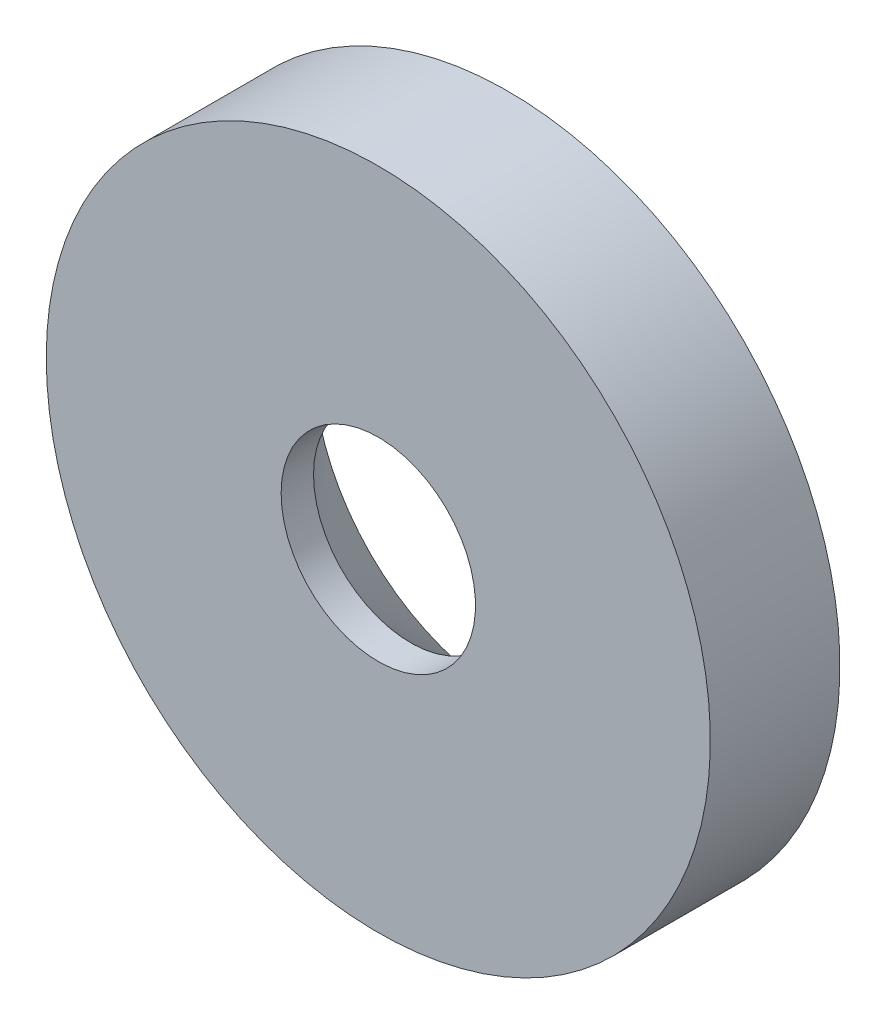
ISO-10303-21;
HEADER;
FILE_DESCRIPTION(('STEP AP214'),'2;1');
FILE_NAME('part.step','',(''),(''),'','','');
FILE_SCHEMA(('AUTOMOTIVE_DESIGN { 1 0 10303 214 1 1 1 1 }'));
ENDSEC;
DATA;
#1=APPLICATION_CONTEXT('core data for automotive mechanical design processes');
#2=APPLICATION_PROTOCOL_DEFINITION('international standard','automotive_design',2000,#1);
#3=PRODUCT_CONTEXT('',#1,'mechanical');
#4=PRODUCT('Part','Part','',(#3));
#5=PRODUCT_RELATED_PRODUCT_CATEGORY('part','',(#4));
#6=PRODUCT_DEFINITION_FORMATION('','',#4);
#7=PRODUCT_DEFINITION_CONTEXT('part definition',#1,'design');
#8=PRODUCT_DEFINITION('design','',#6,#7);
#9=PRODUCT_DEFINITION_SHAPE('','',#8);
#10=(LENGTH_UNIT() NAMED_UNIT(*) SI_UNIT(.MILLI.,.METRE.));
#11=(NAMED_UNIT(*) PLANE_ANGLE_UNIT() SI_UNIT($,.RADIAN.));
#12=(NAMED_UNIT(*) SI_UNIT($,.STERADIAN.) SOLID_ANGLE_UNIT());
#13=UNCERTAINTY_MEASURE_WITH_UNIT(LENGTH_MEASURE(1.E-05),#10,'distance_accuracy_value','');
#14=(GEOMETRIC_REPRESENTATION_CONTEXT(3) GLOBAL_UNCERTAINTY_ASSIGNED_CONTEXT((#13)) GLOBAL_UNIT_ASSIGNED_CONTEXT((#10,
#11,#12)) REPRESENTATION_CONTEXT('',''));
#15=CARTESIAN_POINT('',(0.,0.,0.));
#16=DIRECTION('',(0.,0.,1.));
#17=DIRECTION('',(1.,0.,0.));
#18=AXIS2_PLACEMENT_3D('',#15,#16,#17);
#19=CARTESIAN_POINT('',(0.,0.,-17.2571428571429));
#20=DIRECTION('',(0.,0.,-1.));
#21=DIRECTION('',(-1.,0.,0.));
#22=AXIS2_PLACEMENT_3D('',#19,#20,#21);
#23=CYLINDRICAL_SURFACE('',#22,20.5);
#24=CARTESIAN_POINT('',(0.,0.,-8.));
#25=DIRECTION('',(0.,0.,-1.));
#26=DIRECTION('',(-1.,0.,0.));
#27=AXIS2_PLACEMENT_3D('',#24,#25,#26);
#28=CIRCLE('',#27,20.5);
#29=CARTESIAN_POINT('',(-20.5,0.,-8.));
#30=VERTEX_POINT('',#29);
#31=EDGE_CURVE('E10',#30,#30,#28,.T.);
#32=ORIENTED_EDGE('',*,*,#31,.F.);
#33=EDGE_LOOP('',(#32));
#34=FACE_BOUND('',#33,.T.);
#35=CARTESIAN_POINT('',(0.,0.,0.));
#36=DIRECTION('',(0.,0.,-1.));
#37=DIRECTION('',(-1.,0.,0.));
#38=AXIS2_PLACEMENT_3D('',#35,#36,#37);
#39=CIRCLE('',#38,20.5);
#40=CARTESIAN_POINT('',(-20.5,0.,0.));
#41=VERTEX_POINT('',#40);
#42=EDGE_CURVE('E57',#41,#41,#39,.T.);
#43=ORIENTED_EDGE('',*,*,#42,.T.);
#44=EDGE_LOOP('',(#43));
#45=FACE_BOUND('',#44,.T.);
#46=ADVANCED_FACE('F38',(#34,#45),#23,.T.);
#47=CARTESIAN_POINT('',(20.5,0.,-8.));
#48=DIRECTION('',(0.,0.,1.));
#49=DIRECTION('',(1.,0.,0.));
#50=AXIS2_PLACEMENT_3D('',#47,#48,#49);
#51=PLANE('',#50);
#52=CARTESIAN_POINT('',(0.,0.,-8.));
#53=DIRECTION('',(0.,0.,-1.));
#54=DIRECTION('',(-1.,0.,0.));
#55=AXIS2_PLACEMENT_3D('',#52,#53,#54);
#56=CIRCLE('',#55,11.9999999999999);
#57=CARTESIAN_POINT('',(-11.9999999999999,0.,-8.));
#58=VERTEX_POINT('',#57);
#59=EDGE_CURVE('E44',#58,#58,#56,.T.);
#60=ORIENTED_EDGE('',*,*,#59,.F.);
#61=EDGE_LOOP('',(#60));
#62=FACE_BOUND('',#61,.T.);
#63=ORIENTED_EDGE('',*,*,#31,.T.);
#64=EDGE_LOOP('',(#63));
#65=FACE_BOUND('',#64,.T.);
#66=ADVANCED_FACE('F76',(#62,#65),#51,.F.);
#67=CARTESIAN_POINT('',(0.,0.,-8.));
#68=DIRECTION('',(0.,0.,-1.));
#69=DIRECTION('',(-1.,0.,0.));
#70=AXIS2_PLACEMENT_3D('',#67,#68,#69);
#71=CONICAL_SURFACE('',#70,11.9999999999999,0.785398163397443);
#72=CARTESIAN_POINT('',(0.,0.,-2.));
#73=DIRECTION('',(0.,0.,-1.));
#74=DIRECTION('',(-1.,0.,0.));
#75=AXIS2_PLACEMENT_3D('',#72,#73,#74);
#76=CIRCLE('',#75,6.);
#77=CARTESIAN_POINT('',(-6.,0.,-2.));
#78=VERTEX_POINT('',#77);
#79=EDGE_CURVE('E48',#78,#78,#76,.T.);
#80=ORIENTED_EDGE('',*,*,#79,.F.);
#81=EDGE_LOOP('',(#80));
#82=FACE_BOUND('',#81,.T.);
#83=ORIENTED_EDGE('',*,*,#59,.T.);
#84=EDGE_LOOP('',(#83));
#85=FACE_BOUND('',#84,.T.);
#86=ADVANCED_FACE('F71',(#82,#85),#71,.F.);
#87=CARTESIAN_POINT('',(0.,0.,-17.2571428571429));
#88=DIRECTION('',(0.,0.,-1.));
#89=DIRECTION('',(-1.,0.,0.));
#90=AXIS2_PLACEMENT_3D('',#87,#88,#89);
#91=CYLINDRICAL_SURFACE('',#90,6.);
#92=CARTESIAN_POINT('',(0.,0.,0.));
#93=DIRECTION('',(0.,0.,-1.));
#94=DIRECTION('',(-1.,0.,0.));
#95=AXIS2_PLACEMENT_3D('',#92,#93,#94);
#96=CIRCLE('',#95,6.);
#97=CARTESIAN_POINT('',(-6.,0.,0.));
#98=VERTEX_POINT('',#97);
#99=EDGE_CURVE('E52',#98,#98,#96,.T.);
#100=ORIENTED_EDGE('',*,*,#99,.F.);
#101=EDGE_LOOP('',(#100));
#102=FACE_BOUND('',#101,.T.);
#103=ORIENTED_EDGE('',*,*,#79,.T.);
#104=EDGE_LOOP('',(#103));
#105=FACE_BOUND('',#104,.T.);
#106=ADVANCED_FACE('F65',(#102,#105),#91,.F.);
#107=CARTESIAN_POINT('',(6.,0.,0.));
#108=DIRECTION('',(0.,0.,-1.));
#109=DIRECTION('',(-1.,0.,0.));
#110=AXIS2_PLACEMENT_3D('',#107,#108,#109);
#111=PLANE('',#110);
#112=ORIENTED_EDGE('',*,*,#42,.F.);
#113=EDGE_LOOP('',(#112));
#114=FACE_BOUND('',#113,.T.);
#115=ORIENTED_EDGE('',*,*,#99,.T.);
#116=EDGE_LOOP('',(#115));
#117=FACE_BOUND('',#116,.T.);
#118=ADVANCED_FACE('F62',(#114,#117),#111,.F.);
#119=CLOSED_SHELL('',(#46,#66,#86,#106,#118));
#120=MANIFOLD_SOLID_BREP('B2',#119);
#121=ADVANCED_BREP_SHAPE_REPRESENTATION('',(#18,#120),#14);
#122=SHAPE_DEFINITION_REPRESENTATION(#9,#121);
ENDSEC;
END-ISO-10303-21;
